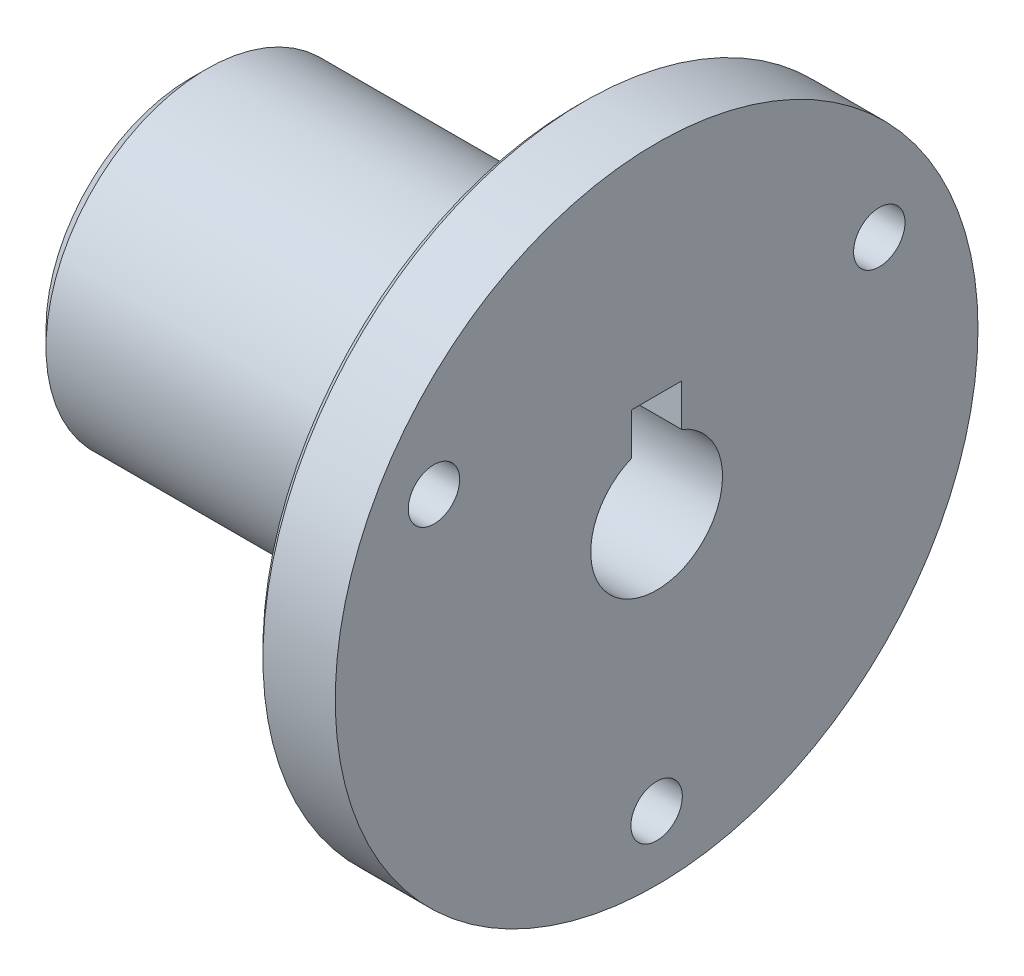
ISO-10303-21;
HEADER;
FILE_DESCRIPTION(('STEP AP214'),'2;1');
FILE_NAME('part.step','',(''),(''),'','','');
FILE_SCHEMA(('AUTOMOTIVE_DESIGN { 1 0 10303 214 1 1 1 1 }'));
ENDSEC;
DATA;
#1=APPLICATION_CONTEXT('core data for automotive mechanical design processes');
#2=APPLICATION_PROTOCOL_DEFINITION('international standard','automotive_design',2000,#1);
#3=PRODUCT_CONTEXT('',#1,'mechanical');
#4=PRODUCT('Part','Part','',(#3));
#5=PRODUCT_RELATED_PRODUCT_CATEGORY('part','',(#4));
#6=PRODUCT_DEFINITION_FORMATION('','',#4);
#7=PRODUCT_DEFINITION_CONTEXT('part definition',#1,'design');
#8=PRODUCT_DEFINITION('design','',#6,#7);
#9=PRODUCT_DEFINITION_SHAPE('','',#8);
#10=(LENGTH_UNIT() NAMED_UNIT(*) SI_UNIT(.MILLI.,.METRE.));
#11=(NAMED_UNIT(*) PLANE_ANGLE_UNIT() SI_UNIT($,.RADIAN.));
#12=(NAMED_UNIT(*) SI_UNIT($,.STERADIAN.) SOLID_ANGLE_UNIT());
#13=UNCERTAINTY_MEASURE_WITH_UNIT(LENGTH_MEASURE(1.E-05),#10,'distance_accuracy_value','');
#14=(GEOMETRIC_REPRESENTATION_CONTEXT(3) GLOBAL_UNCERTAINTY_ASSIGNED_CONTEXT((#13)) GLOBAL_UNIT_ASSIGNED_CONTEXT((#10,
#11,#12)) REPRESENTATION_CONTEXT('',''));
#15=CARTESIAN_POINT('',(0.,0.,0.));
#16=DIRECTION('',(0.,0.,1.));
#17=DIRECTION('',(1.,0.,0.));
#18=AXIS2_PLACEMENT_3D('',#15,#16,#17);
#19=CARTESIAN_POINT('',(0.,0.,0.));
#20=DIRECTION('',(1.,0.,0.));
#21=DIRECTION('',(0.,0.,-1.));
#22=AXIS2_PLACEMENT_3D('',#19,#20,#21);
#23=PLANE('',#22);
#24=CARTESIAN_POINT('',(0.,0.,0.));
#25=DIRECTION('',(1.,0.,0.));
#26=DIRECTION('',(0.,0.,-1.));
#27=AXIS2_PLACEMENT_3D('',#24,#25,#26);
#28=CIRCLE('',#27,9.);
#29=CARTESIAN_POINT('',(0.,0.,-9.));
#30=VERTEX_POINT('',#29);
#31=EDGE_CURVE('E135',#30,#30,#28,.F.);
#32=ORIENTED_EDGE('',*,*,#31,.T.);
#33=EDGE_LOOP('',(#32));
#34=FACE_BOUND('',#33,.T.);
#35=DIRECTION('',(0.,-1.,0.));
#36=VECTOR('',#35,1.);
#37=CARTESIAN_POINT('',(0.,6.4,1.55));
#38=LINE('',#37,#36);
#39=CARTESIAN_POINT('',(0.,6.4,1.55));
#40=VERTEX_POINT('',#39);
#41=CARTESIAN_POINT('',(0.,4.33099295774075,1.55));
#42=VERTEX_POINT('',#41);
#43=EDGE_CURVE('E99',#40,#42,#38,.T.);
#44=ORIENTED_EDGE('',*,*,#43,.T.);
#45=CARTESIAN_POINT('',(0.,0.,0.));
#46=DIRECTION('',(1.,0.,0.));
#47=DIRECTION('',(0.,0.,-1.));
#48=AXIS2_PLACEMENT_3D('',#45,#46,#47);
#49=CIRCLE('',#48,4.59999999999999);
#50=CARTESIAN_POINT('',(0.,4.33099295774075,-1.55));
#51=VERTEX_POINT('',#50);
#52=EDGE_CURVE('E179',#42,#51,#49,.T.);
#53=ORIENTED_EDGE('',*,*,#52,.T.);
#54=DIRECTION('',(0.,1.,0.));
#55=VECTOR('',#54,1.);
#56=CARTESIAN_POINT('',(0.,6.4,-1.55));
#57=LINE('',#56,#55);
#58=CARTESIAN_POINT('',(0.,6.4,-1.55));
#59=VERTEX_POINT('',#58);
#60=EDGE_CURVE('E210',#51,#59,#57,.T.);
#61=ORIENTED_EDGE('',*,*,#60,.T.);
#62=DIRECTION('',(0.,0.,1.));
#63=VECTOR('',#62,1.);
#64=CARTESIAN_POINT('',(0.,6.4,0.));
#65=LINE('',#64,#63);
#66=EDGE_CURVE('E196',#59,#40,#65,.T.);
#67=ORIENTED_EDGE('',*,*,#66,.T.);
#68=EDGE_LOOP('',(#44,#53,#61,#67));
#69=FACE_BOUND('',#68,.T.);
#70=ADVANCED_FACE('F43',(#34,#69),#23,.F.);
#71=CARTESIAN_POINT('',(24.,0.,0.));
#72=DIRECTION('',(-1.,0.,0.));
#73=DIRECTION('',(0.,0.,1.));
#74=AXIS2_PLACEMENT_3D('',#71,#72,#73);
#75=CYLINDRICAL_SURFACE('',#74,10.);
#76=CARTESIAN_POINT('',(22.,0.,0.));
#77=DIRECTION('',(1.,0.,0.));
#78=DIRECTION('',(0.,0.,-1.));
#79=AXIS2_PLACEMENT_3D('',#76,#77,#78);
#80=CIRCLE('',#79,10.);
#81=CARTESIAN_POINT('',(22.,0.,-10.));
#82=VERTEX_POINT('',#81);
#83=EDGE_CURVE('E111',#82,#82,#80,.F.);
#84=ORIENTED_EDGE('',*,*,#83,.T.);
#85=EDGE_LOOP('',(#84));
#86=FACE_BOUND('',#85,.T.);
#87=CARTESIAN_POINT('',(0.999999999999994,0.,0.));
#88=DIRECTION('',(1.,0.,0.));
#89=DIRECTION('',(0.,0.,-1.));
#90=AXIS2_PLACEMENT_3D('',#87,#88,#89);
#91=CIRCLE('',#90,10.);
#92=CARTESIAN_POINT('',(0.999999999999994,0.,-10.));
#93=VERTEX_POINT('',#92);
#94=EDGE_CURVE('E139',#93,#93,#91,.T.);
#95=ORIENTED_EDGE('',*,*,#94,.T.);
#96=EDGE_LOOP('',(#95));
#97=FACE_BOUND('',#96,.T.);
#98=ADVANCED_FACE('F168',(#86,#97),#75,.T.);
#99=CARTESIAN_POINT('',(24.,6.4,-1.55));
#100=DIRECTION('',(0.,0.,1.));
#101=DIRECTION('',(1.,0.,0.));
#102=AXIS2_PLACEMENT_3D('',#99,#100,#101);
#103=PLANE('',#102);
#104=ORIENTED_EDGE('',*,*,#60,.F.);
#105=CARTESIAN_POINT('',(0.,4.33099295774075,-1.55));
#106=CARTESIAN_POINT('',(0.0837068873602066,4.24212999148662,-1.55));
#107=CARTESIAN_POINT('',(0.167226987253939,4.1530925461102,-1.55));
#108=CARTESIAN_POINT('',(0.333893654108889,3.97466865214947,-1.55));
#109=CARTESIAN_POINT('',(0.417040220881824,3.8852822033893,-1.55));
#110=CARTESIAN_POINT('',(0.500000000000001,3.79572127533095,-1.55));
#111=B_SPLINE_CURVE_WITH_KNOTS('',3,(#105,#106,#107,#108,#109,#110),.UNSPECIFIED.,.F.,.F.,(4,2,
4),(0.,0.36623689585945,0.732473976304258),.UNSPECIFIED.);
#112=CARTESIAN_POINT('',(0.5,3.79572127533095,-1.55));
#113=VERTEX_POINT('',#112);
#114=EDGE_CURVE('E171',#51,#113,#111,.T.);
#115=ORIENTED_EDGE('',*,*,#114,.T.);
#116=DIRECTION('',(-1.,0.,0.));
#117=VECTOR('',#116,1.);
#118=CARTESIAN_POINT('',(24.,3.79572127533095,-1.55));
#119=LINE('',#118,#117);
#120=CARTESIAN_POINT('',(29.,3.79572127533095,-1.55));
#121=VERTEX_POINT('',#120);
#122=EDGE_CURVE('E198',#121,#113,#119,.T.);
#123=ORIENTED_EDGE('',*,*,#122,.F.);
#124=DIRECTION('',(0.,1.,0.));
#125=VECTOR('',#124,1.);
#126=CARTESIAN_POINT('',(29.,0.,-1.55));
#127=LINE('',#126,#125);
#128=CARTESIAN_POINT('',(29.,6.4,-1.55));
#129=VERTEX_POINT('',#128);
#130=EDGE_CURVE('E110',#121,#129,#127,.T.);
#131=ORIENTED_EDGE('',*,*,#130,.T.);
#132=DIRECTION('',(-1.,0.,0.));
#133=VECTOR('',#132,1.);
#134=CARTESIAN_POINT('',(24.,6.4,-1.55));
#135=LINE('',#134,#133);
#136=EDGE_CURVE('E60',#129,#59,#135,.T.);
#137=ORIENTED_EDGE('',*,*,#136,.T.);
#138=EDGE_LOOP('',(#104,#115,#123,#131,#137));
#139=FACE_BOUND('',#138,.T.);
#140=ADVANCED_FACE('F181',(#139),#103,.T.);
#141=CARTESIAN_POINT('',(24.,6.4,0.));
#142=DIRECTION('',(0.,-1.,0.));
#143=DIRECTION('',(0.,0.,-1.));
#144=AXIS2_PLACEMENT_3D('',#141,#142,#143);
#145=PLANE('',#144);
#146=ORIENTED_EDGE('',*,*,#66,.F.);
#147=ORIENTED_EDGE('',*,*,#136,.F.);
#148=DIRECTION('',(0.,0.,1.));
#149=VECTOR('',#148,1.);
#150=CARTESIAN_POINT('',(29.,6.4,0.));
#151=LINE('',#150,#149);
#152=CARTESIAN_POINT('',(29.,6.4,1.55));
#153=VERTEX_POINT('',#152);
#154=EDGE_CURVE('E105',#129,#153,#151,.T.);
#155=ORIENTED_EDGE('',*,*,#154,.T.);
#156=DIRECTION('',(-1.,0.,0.));
#157=VECTOR('',#156,1.);
#158=CARTESIAN_POINT('',(24.,6.4,1.55));
#159=LINE('',#158,#157);
#160=EDGE_CURVE('E94',#153,#40,#159,.T.);
#161=ORIENTED_EDGE('',*,*,#160,.T.);
#162=EDGE_LOOP('',(#146,#147,#155,#161));
#163=FACE_BOUND('',#162,.T.);
#164=ADVANCED_FACE('F106',(#163),#145,.T.);
#165=CARTESIAN_POINT('',(24.,6.4,1.55));
#166=DIRECTION('',(0.,0.,-1.));
#167=DIRECTION('',(-1.,0.,0.));
#168=AXIS2_PLACEMENT_3D('',#165,#166,#167);
#169=PLANE('',#168);
#170=DIRECTION('',(-1.,0.,0.));
#171=VECTOR('',#170,1.);
#172=CARTESIAN_POINT('',(24.,3.79572127533095,1.55));
#173=LINE('',#172,#171);
#174=CARTESIAN_POINT('',(29.,3.79572127533095,1.55));
#175=VERTEX_POINT('',#174);
#176=CARTESIAN_POINT('',(0.5,3.79572127533095,1.55));
#177=VERTEX_POINT('',#176);
#178=EDGE_CURVE('E102',#175,#177,#173,.T.);
#179=ORIENTED_EDGE('',*,*,#178,.T.);
#180=CARTESIAN_POINT('',(0.5,3.79572127533095,1.55));
#181=CARTESIAN_POINT('',(0.417040220881824,3.8852822033893,1.55));
#182=CARTESIAN_POINT('',(0.333893654108889,3.97466865214947,1.55));
#183=CARTESIAN_POINT('',(0.167226987253938,4.1530925461102,1.55));
#184=CARTESIAN_POINT('',(0.0837068873602063,4.24212999148662,1.55));
#185=CARTESIAN_POINT('',(0.,4.33099295774075,1.55));
#186=B_SPLINE_CURVE_WITH_KNOTS('',3,(#180,#181,#182,#183,#184,#185),.UNSPECIFIED.,.F.,.F.,(4,2,
4),(0.,0.366237080444808,0.732473976304257),.UNSPECIFIED.);
#187=EDGE_CURVE('E143',#177,#42,#186,.T.);
#188=ORIENTED_EDGE('',*,*,#187,.T.);
#189=ORIENTED_EDGE('',*,*,#43,.F.);
#190=ORIENTED_EDGE('',*,*,#160,.F.);
#191=DIRECTION('',(0.,-1.,0.));
#192=VECTOR('',#191,1.);
#193=CARTESIAN_POINT('',(29.,0.,1.55));
#194=LINE('',#193,#192);
#195=EDGE_CURVE('E11',#153,#175,#194,.T.);
#196=ORIENTED_EDGE('',*,*,#195,.T.);
#197=EDGE_LOOP('',(#179,#188,#189,#190,#196));
#198=FACE_BOUND('',#197,.T.);
#199=ADVANCED_FACE('F95',(#198),#169,.T.);
#200=CARTESIAN_POINT('',(24.,0.,0.));
#201=DIRECTION('',(-1.,0.,0.));
#202=DIRECTION('',(0.,0.,1.));
#203=AXIS2_PLACEMENT_3D('',#200,#201,#202);
#204=CYLINDRICAL_SURFACE('',#203,4.1);
#205=ORIENTED_EDGE('',*,*,#122,.T.);
#206=CARTESIAN_POINT('',(0.5,0.,0.));
#207=DIRECTION('',(1.,0.,0.));
#208=DIRECTION('',(0.,0.,-1.));
#209=AXIS2_PLACEMENT_3D('',#206,#207,#208);
#210=CIRCLE('',#209,4.1);
#211=EDGE_CURVE('E68',#113,#177,#210,.F.);
#212=ORIENTED_EDGE('',*,*,#211,.T.);
#213=ORIENTED_EDGE('',*,*,#178,.F.);
#214=CARTESIAN_POINT('',(29.,0.,0.));
#215=DIRECTION('',(1.,0.,0.));
#216=DIRECTION('',(0.,0.,-1.));
#217=AXIS2_PLACEMENT_3D('',#214,#215,#216);
#218=CIRCLE('',#217,4.1);
#219=EDGE_CURVE('E53',#175,#121,#218,.T.);
#220=ORIENTED_EDGE('',*,*,#219,.T.);
#221=EDGE_LOOP('',(#205,#212,#213,#220));
#222=FACE_BOUND('',#221,.T.);
#223=ADVANCED_FACE('F255',(#222),#204,.F.);
#224=CARTESIAN_POINT('',(24.,0.,0.));
#225=DIRECTION('',(1.,0.,0.));
#226=DIRECTION('',(0.,0.,-1.));
#227=AXIS2_PLACEMENT_3D('',#224,#225,#226);
#228=PLANE('',#227);
#229=CARTESIAN_POINT('',(24.,0.,0.));
#230=DIRECTION('',(1.,0.,0.));
#231=DIRECTION('',(0.,0.,-1.));
#232=AXIS2_PLACEMENT_3D('',#229,#230,#231);
#233=CIRCLE('',#232,12.);
#234=CARTESIAN_POINT('',(24.,0.,-12.));
#235=VERTEX_POINT('',#234);
#236=EDGE_CURVE('E123',#235,#235,#233,.T.);
#237=ORIENTED_EDGE('',*,*,#236,.T.);
#238=EDGE_LOOP('',(#237));
#239=FACE_BOUND('',#238,.T.);
#240=CARTESIAN_POINT('',(24.,0.,0.));
#241=DIRECTION('',(1.,0.,0.));
#242=DIRECTION('',(0.,0.,-1.));
#243=AXIS2_PLACEMENT_3D('',#240,#241,#242);
#244=CIRCLE('',#243,19.5);
#245=CARTESIAN_POINT('',(24.,0.,-19.5));
#246=VERTEX_POINT('',#245);
#247=EDGE_CURVE('E127',#246,#246,#244,.F.);
#248=ORIENTED_EDGE('',*,*,#247,.T.);
#249=EDGE_LOOP('',(#248));
#250=FACE_BOUND('',#249,.T.);
#251=CARTESIAN_POINT('',(24.,-16.,0.));
#252=DIRECTION('',(1.,0.,0.));
#253=DIRECTION('',(0.,0.,-1.));
#254=AXIS2_PLACEMENT_3D('',#251,#252,#253);
#255=CIRCLE('',#254,1.6);
#256=CARTESIAN_POINT('',(24.,-16.,-1.6));
#257=VERTEX_POINT('',#256);
#258=EDGE_CURVE('E234',#257,#257,#255,.T.);
#259=ORIENTED_EDGE('',*,*,#258,.T.);
#260=EDGE_LOOP('',(#259));
#261=FACE_BOUND('',#260,.T.);
#262=CARTESIAN_POINT('',(24.,8.,-13.856406460551));
#263=DIRECTION('',(1.,0.,0.));
#264=DIRECTION('',(0.,0.,-1.));
#265=AXIS2_PLACEMENT_3D('',#262,#263,#264);
#266=CIRCLE('',#265,1.6);
#267=CARTESIAN_POINT('',(24.,8.,-15.456406460551));
#268=VERTEX_POINT('',#267);
#269=EDGE_CURVE('E226',#268,#268,#266,.T.);
#270=ORIENTED_EDGE('',*,*,#269,.T.);
#271=EDGE_LOOP('',(#270));
#272=FACE_BOUND('',#271,.T.);
#273=CARTESIAN_POINT('',(24.,7.99999999999991,13.8564064605511));
#274=DIRECTION('',(1.,0.,0.));
#275=DIRECTION('',(0.,0.,-1.));
#276=AXIS2_PLACEMENT_3D('',#273,#274,#275);
#277=CIRCLE('',#276,1.6);
#278=CARTESIAN_POINT('',(24.,7.99999999999991,12.2564064605511));
#279=VERTEX_POINT('',#278);
#280=EDGE_CURVE('E218',#279,#279,#277,.T.);
#281=ORIENTED_EDGE('',*,*,#280,.T.);
#282=EDGE_LOOP('',(#281));
#283=FACE_BOUND('',#282,.T.);
#284=ADVANCED_FACE('F246',(#239,#250,#261,#272,#283),#228,.F.);
#285=CARTESIAN_POINT('',(29.,0.,0.));
#286=DIRECTION('',(1.,0.,0.));
#287=DIRECTION('',(0.,0.,-1.));
#288=AXIS2_PLACEMENT_3D('',#285,#286,#287);
#289=PLANE('',#288);
#290=ORIENTED_EDGE('',*,*,#195,.F.);
#291=ORIENTED_EDGE('',*,*,#154,.F.);
#292=ORIENTED_EDGE('',*,*,#130,.F.);
#293=ORIENTED_EDGE('',*,*,#219,.F.);
#294=EDGE_LOOP('',(#290,#291,#292,#293));
#295=FACE_BOUND('',#294,.T.);
#296=CARTESIAN_POINT('',(29.,8.,-13.856406460551));
#297=DIRECTION('',(1.,0.,0.));
#298=DIRECTION('',(0.,0.,-1.));
#299=AXIS2_PLACEMENT_3D('',#296,#297,#298);
#300=CIRCLE('',#299,1.6);
#301=CARTESIAN_POINT('',(29.,8.,-15.456406460551));
#302=VERTEX_POINT('',#301);
#303=EDGE_CURVE('E222',#302,#302,#300,.T.);
#304=ORIENTED_EDGE('',*,*,#303,.F.);
#305=EDGE_LOOP('',(#304));
#306=FACE_BOUND('',#305,.T.);
#307=CARTESIAN_POINT('',(29.,0.,0.));
#308=DIRECTION('',(1.,0.,0.));
#309=DIRECTION('',(0.,0.,-1.));
#310=AXIS2_PLACEMENT_3D('',#307,#308,#309);
#311=CIRCLE('',#310,20.);
#312=CARTESIAN_POINT('',(29.,0.,-20.));
#313=VERTEX_POINT('',#312);
#314=EDGE_CURVE('E213',#313,#313,#311,.T.);
#315=ORIENTED_EDGE('',*,*,#314,.T.);
#316=EDGE_LOOP('',(#315));
#317=FACE_BOUND('',#316,.T.);
#318=CARTESIAN_POINT('',(29.,7.99999999999991,13.8564064605511));
#319=DIRECTION('',(1.,0.,0.));
#320=DIRECTION('',(0.,0.,-1.));
#321=AXIS2_PLACEMENT_3D('',#318,#319,#320);
#322=CIRCLE('',#321,1.6);
#323=CARTESIAN_POINT('',(29.,7.99999999999991,12.2564064605511));
#324=VERTEX_POINT('',#323);
#325=EDGE_CURVE('E217',#324,#324,#322,.T.);
#326=ORIENTED_EDGE('',*,*,#325,.F.);
#327=EDGE_LOOP('',(#326));
#328=FACE_BOUND('',#327,.T.);
#329=CARTESIAN_POINT('',(29.,-16.,0.));
#330=DIRECTION('',(1.,0.,0.));
#331=DIRECTION('',(0.,0.,-1.));
#332=AXIS2_PLACEMENT_3D('',#329,#330,#331);
#333=CIRCLE('',#332,1.6);
#334=CARTESIAN_POINT('',(29.,-16.,-1.6));
#335=VERTEX_POINT('',#334);
#336=EDGE_CURVE('E230',#335,#335,#333,.T.);
#337=ORIENTED_EDGE('',*,*,#336,.F.);
#338=EDGE_LOOP('',(#337));
#339=FACE_BOUND('',#338,.T.);
#340=ADVANCED_FACE('F113',(#295,#306,#317,#328,#339),#289,.T.);
#341=CARTESIAN_POINT('',(29.,0.,0.));
#342=DIRECTION('',(-1.,0.,0.));
#343=DIRECTION('',(0.,0.,1.));
#344=AXIS2_PLACEMENT_3D('',#341,#342,#343);
#345=CYLINDRICAL_SURFACE('',#344,20.);
#346=CARTESIAN_POINT('',(24.5,0.,0.));
#347=DIRECTION('',(1.,0.,0.));
#348=DIRECTION('',(0.,0.,-1.));
#349=AXIS2_PLACEMENT_3D('',#346,#347,#348);
#350=CIRCLE('',#349,20.);
#351=CARTESIAN_POINT('',(24.5,0.,-20.));
#352=VERTEX_POINT('',#351);
#353=EDGE_CURVE('E131',#352,#352,#350,.T.);
#354=ORIENTED_EDGE('',*,*,#353,.T.);
#355=EDGE_LOOP('',(#354));
#356=FACE_BOUND('',#355,.T.);
#357=ORIENTED_EDGE('',*,*,#314,.F.);
#358=EDGE_LOOP('',(#357));
#359=FACE_BOUND('',#358,.T.);
#360=ADVANCED_FACE('F245',(#356,#359),#345,.T.);
#361=CARTESIAN_POINT('',(29.,7.99999999999991,13.8564064605511));
#362=DIRECTION('',(-1.,0.,0.));
#363=DIRECTION('',(0.,0.,1.));
#364=AXIS2_PLACEMENT_3D('',#361,#362,#363);
#365=CYLINDRICAL_SURFACE('',#364,1.6);
#366=ORIENTED_EDGE('',*,*,#325,.T.);
#367=EDGE_LOOP('',(#366));
#368=FACE_BOUND('',#367,.T.);
#369=ORIENTED_EDGE('',*,*,#280,.F.);
#370=EDGE_LOOP('',(#369));
#371=FACE_BOUND('',#370,.T.);
#372=ADVANCED_FACE('F252',(#368,#371),#365,.F.);
#373=CARTESIAN_POINT('',(29.,8.,-13.856406460551));
#374=DIRECTION('',(-1.,0.,0.));
#375=DIRECTION('',(0.,0.,1.));
#376=AXIS2_PLACEMENT_3D('',#373,#374,#375);
#377=CYLINDRICAL_SURFACE('',#376,1.6);
#378=ORIENTED_EDGE('',*,*,#303,.T.);
#379=EDGE_LOOP('',(#378));
#380=FACE_BOUND('',#379,.T.);
#381=ORIENTED_EDGE('',*,*,#269,.F.);
#382=EDGE_LOOP('',(#381));
#383=FACE_BOUND('',#382,.T.);
#384=ADVANCED_FACE('F322',(#380,#383),#377,.F.);
#385=CARTESIAN_POINT('',(29.,-16.,0.));
#386=DIRECTION('',(-1.,0.,0.));
#387=DIRECTION('',(0.,0.,1.));
#388=AXIS2_PLACEMENT_3D('',#385,#386,#387);
#389=CYLINDRICAL_SURFACE('',#388,1.6);
#390=ORIENTED_EDGE('',*,*,#336,.T.);
#391=EDGE_LOOP('',(#390));
#392=FACE_BOUND('',#391,.T.);
#393=ORIENTED_EDGE('',*,*,#258,.F.);
#394=EDGE_LOOP('',(#393));
#395=FACE_BOUND('',#394,.T.);
#396=ADVANCED_FACE('F166',(#392,#395),#389,.F.);
#397=CARTESIAN_POINT('',(0.,0.,0.));
#398=DIRECTION('',(-1.,0.,0.));
#399=DIRECTION('',(0.,0.,1.));
#400=AXIS2_PLACEMENT_3D('',#397,#398,#399);
#401=CONICAL_SURFACE('',#400,4.59999999999999,0.785398163397441);
#402=ORIENTED_EDGE('',*,*,#187,.F.);
#403=ORIENTED_EDGE('',*,*,#211,.F.);
#404=ORIENTED_EDGE('',*,*,#114,.F.);
#405=ORIENTED_EDGE('',*,*,#52,.F.);
#406=EDGE_LOOP('',(#402,#403,#404,#405));
#407=FACE_BOUND('',#406,.T.);
#408=ADVANCED_FACE('F157',(#407),#401,.F.);
#409=CARTESIAN_POINT('',(0.999999999999994,0.,0.));
#410=DIRECTION('',(1.,0.,0.));
#411=DIRECTION('',(0.,0.,-1.));
#412=AXIS2_PLACEMENT_3D('',#409,#410,#411);
#413=CONICAL_SURFACE('',#412,10.,0.785398163397451);
#414=ORIENTED_EDGE('',*,*,#31,.F.);
#415=EDGE_LOOP('',(#414));
#416=FACE_BOUND('',#415,.T.);
#417=ORIENTED_EDGE('',*,*,#94,.F.);
#418=EDGE_LOOP('',(#417));
#419=FACE_BOUND('',#418,.T.);
#420=ADVANCED_FACE('F165',(#416,#419),#413,.T.);
#421=CARTESIAN_POINT('',(24.5,0.,0.));
#422=DIRECTION('',(1.,0.,0.));
#423=DIRECTION('',(0.,0.,-1.));
#424=AXIS2_PLACEMENT_3D('',#421,#422,#423);
#425=CONICAL_SURFACE('',#424,20.,0.785398163397455);
#426=ORIENTED_EDGE('',*,*,#247,.F.);
#427=EDGE_LOOP('',(#426));
#428=FACE_BOUND('',#427,.T.);
#429=ORIENTED_EDGE('',*,*,#353,.F.);
#430=EDGE_LOOP('',(#429));
#431=FACE_BOUND('',#430,.T.);
#432=ADVANCED_FACE('F287',(#428,#431),#425,.T.);
#433=CARTESIAN_POINT('',(24.,0.,0.));
#434=DIRECTION('',(1.,0.,0.));
#435=DIRECTION('',(0.,0.,-1.));
#436=AXIS2_PLACEMENT_3D('',#433,#434,#435);
#437=CONICAL_SURFACE('',#436,12.,0.785398163397454);
#438=ORIENTED_EDGE('',*,*,#83,.F.);
#439=EDGE_LOOP('',(#438));
#440=FACE_BOUND('',#439,.T.);
#441=ORIENTED_EDGE('',*,*,#236,.F.);
#442=EDGE_LOOP('',(#441));
#443=FACE_BOUND('',#442,.T.);
#444=ADVANCED_FACE('F46',(#440,#443),#437,.T.);
#445=CLOSED_SHELL('',(#70,#98,#140,#164,#199,#223,#284,#340,#360,#372,#384,#396,#408,#420,#432,#444));
#446=MANIFOLD_SOLID_BREP('B2',#445);
#447=ADVANCED_BREP_SHAPE_REPRESENTATION('',(#18,#446),#14);
#448=SHAPE_DEFINITION_REPRESENTATION(#9,#447);
ENDSEC;
END-ISO-10303-21;
